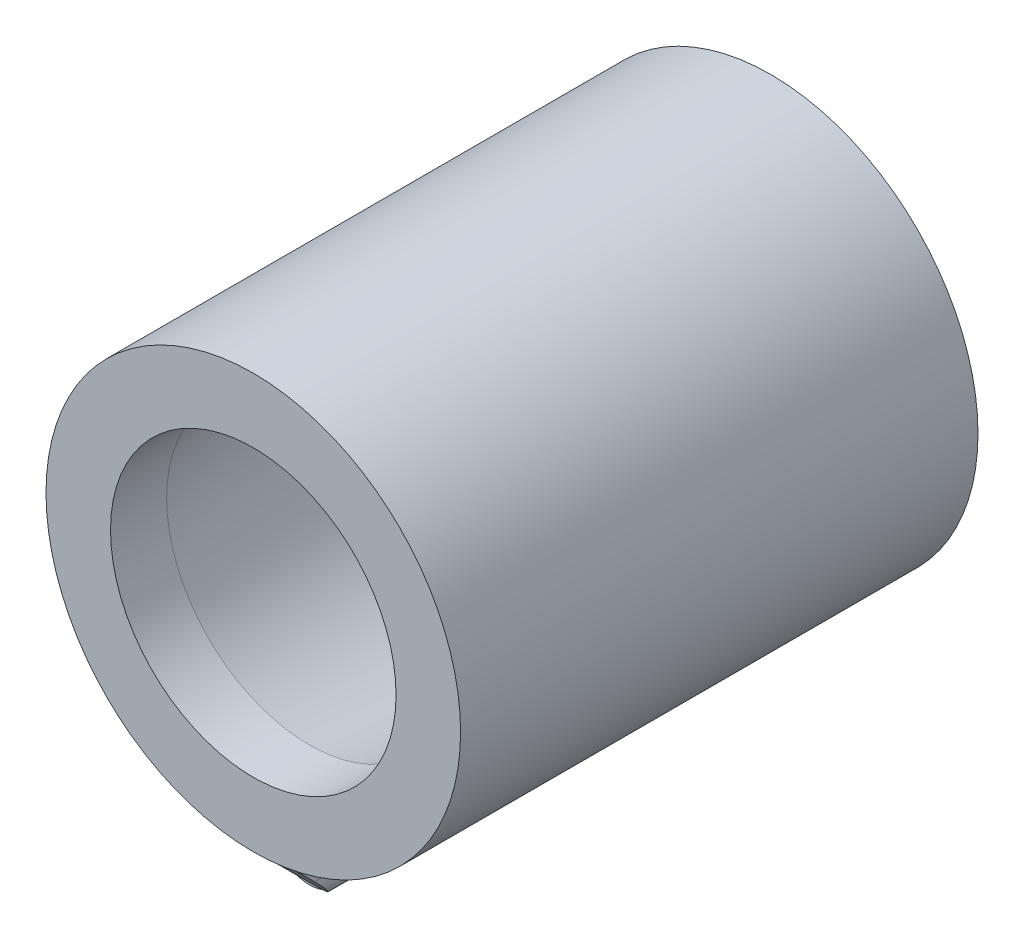
ISO-10303-21;
HEADER;
FILE_DESCRIPTION(('STEP AP214'),'2;1');
FILE_NAME('part.step','',(''),(''),'','','');
FILE_SCHEMA(('AUTOMOTIVE_DESIGN { 1 0 10303 214 1 1 1 1 }'));
ENDSEC;
DATA;
#1=APPLICATION_CONTEXT('core data for automotive mechanical design processes');
#2=APPLICATION_PROTOCOL_DEFINITION('international standard','automotive_design',2000,#1);
#3=PRODUCT_CONTEXT('',#1,'mechanical');
#4=PRODUCT('Part','Part','',(#3));
#5=PRODUCT_RELATED_PRODUCT_CATEGORY('part','',(#4));
#6=PRODUCT_DEFINITION_FORMATION('','',#4);
#7=PRODUCT_DEFINITION_CONTEXT('part definition',#1,'design');
#8=PRODUCT_DEFINITION('design','',#6,#7);
#9=PRODUCT_DEFINITION_SHAPE('','',#8);
#10=(LENGTH_UNIT() NAMED_UNIT(*) SI_UNIT(.MILLI.,.METRE.));
#11=(NAMED_UNIT(*) PLANE_ANGLE_UNIT() SI_UNIT($,.RADIAN.));
#12=(NAMED_UNIT(*) SI_UNIT($,.STERADIAN.) SOLID_ANGLE_UNIT());
#13=UNCERTAINTY_MEASURE_WITH_UNIT(LENGTH_MEASURE(1.E-05),#10,'distance_accuracy_value','');
#14=(GEOMETRIC_REPRESENTATION_CONTEXT(3) GLOBAL_UNCERTAINTY_ASSIGNED_CONTEXT((#13)) GLOBAL_UNIT_ASSIGNED_CONTEXT((#10,
#11,#12)) REPRESENTATION_CONTEXT('',''));
#15=CARTESIAN_POINT('',(0.,0.,0.));
#16=DIRECTION('',(0.,0.,1.));
#17=DIRECTION('',(1.,0.,0.));
#18=AXIS2_PLACEMENT_3D('',#15,#16,#17);
#19=CARTESIAN_POINT('',(0.,0.908019807691184,0.));
#20=DIRECTION('',(0.,0.,1.));
#21=DIRECTION('',(1.,0.,0.));
#22=AXIS2_PLACEMENT_3D('',#19,#20,#21);
#23=PLANE('',#22);
#24=CARTESIAN_POINT('',(0.,0.908019807691184,0.));
#25=DIRECTION('',(0.,0.,1.));
#26=DIRECTION('',(1.,0.,0.));
#27=AXIS2_PLACEMENT_3D('',#24,#25,#26);
#28=CIRCLE('',#27,6.25);
#29=CARTESIAN_POINT('',(6.25,0.908019807691184,0.));
#30=VERTEX_POINT('',#29);
#31=EDGE_CURVE('E153',#30,#30,#28,.T.);
#32=ORIENTED_EDGE('',*,*,#31,.T.);
#33=EDGE_LOOP('',(#32));
#34=FACE_BOUND('',#33,.T.);
#35=CARTESIAN_POINT('',(0.,-6.35801980769118,0.));
#36=DIRECTION('',(0.,0.,1.));
#37=DIRECTION('',(1.,0.,0.));
#38=AXIS2_PLACEMENT_3D('',#35,#36,#37);
#39=CIRCLE('',#38,1.2);
#40=CARTESIAN_POINT('',(1.2,-6.35801980769118,0.));
#41=VERTEX_POINT('',#40);
#42=CARTESIAN_POINT('',(0.,-7.55801980769118,0.));
#43=VERTEX_POINT('',#42);
#44=EDGE_CURVE('E174',#41,#43,#39,.F.);
#45=ORIENTED_EDGE('',*,*,#44,.T.);
#46=CARTESIAN_POINT('',(0.,-6.35801980769118,0.));
#47=DIRECTION('',(0.,0.,1.));
#48=DIRECTION('',(1.,0.,0.));
#49=AXIS2_PLACEMENT_3D('',#46,#47,#48);
#50=CIRCLE('',#49,1.2);
#51=CARTESIAN_POINT('',(-1.2,-6.35801980769118,0.));
#52=VERTEX_POINT('',#51);
#53=EDGE_CURVE('E177',#43,#52,#50,.F.);
#54=ORIENTED_EDGE('',*,*,#53,.T.);
#55=DIRECTION('',(0.,-1.,0.));
#56=VECTOR('',#55,1.);
#57=CARTESIAN_POINT('',(-1.2,-5.95801980769118,0.));
#58=LINE('',#57,#56);
#59=CARTESIAN_POINT('',(-1.2,-5.63281347255683,0.));
#60=VERTEX_POINT('',#59);
#61=EDGE_CURVE('E139',#60,#52,#58,.T.);
#62=ORIENTED_EDGE('',*,*,#61,.F.);
#63=CARTESIAN_POINT('',(0.,0.908019807691184,0.));
#64=DIRECTION('',(0.,0.,1.));
#65=DIRECTION('',(1.,0.,0.));
#66=AXIS2_PLACEMENT_3D('',#63,#64,#65);
#67=CIRCLE('',#66,6.65);
#68=CARTESIAN_POINT('',(1.2,-5.63281347255683,0.));
#69=VERTEX_POINT('',#68);
#70=EDGE_CURVE('E145',#69,#60,#67,.T.);
#71=ORIENTED_EDGE('',*,*,#70,.F.);
#72=DIRECTION('',(0.,1.,0.));
#73=VECTOR('',#72,1.);
#74=CARTESIAN_POINT('',(1.2,-7.95801980769118,0.));
#75=LINE('',#74,#73);
#76=EDGE_CURVE('E130',#41,#69,#75,.T.);
#77=ORIENTED_EDGE('',*,*,#76,.F.);
#78=EDGE_LOOP('',(#45,#54,#62,#71,#77));
#79=FACE_BOUND('',#78,.T.);
#80=ADVANCED_FACE('F69',(#34,#79),#23,.F.);
#81=CARTESIAN_POINT('',(0.,0.908019807691184,0.));
#82=DIRECTION('',(0.,0.,1.));
#83=DIRECTION('',(1.,0.,0.));
#84=AXIS2_PLACEMENT_3D('',#81,#82,#83);
#85=CYLINDRICAL_SURFACE('',#84,6.65);
#86=CARTESIAN_POINT('',(0.,0.908019807691184,16.55));
#87=DIRECTION('',(0.,0.,1.));
#88=DIRECTION('',(1.,0.,0.));
#89=AXIS2_PLACEMENT_3D('',#86,#87,#88);
#90=CIRCLE('',#89,6.65);
#91=CARTESIAN_POINT('',(-1.2,-5.63281347255683,16.55));
#92=VERTEX_POINT('',#91);
#93=CARTESIAN_POINT('',(1.2,-5.63281347255683,16.55));
#94=VERTEX_POINT('',#93);
#95=EDGE_CURVE('E148',#92,#94,#90,.T.);
#96=ORIENTED_EDGE('',*,*,#95,.T.);
#97=DIRECTION('',(0.,0.,1.));
#98=VECTOR('',#97,1.);
#99=CARTESIAN_POINT('',(1.2,-5.63281347255683,0.));
#100=LINE('',#99,#98);
#101=EDGE_CURVE('E133',#69,#94,#100,.T.);
#102=ORIENTED_EDGE('',*,*,#101,.F.);
#103=ORIENTED_EDGE('',*,*,#70,.T.);
#104=DIRECTION('',(0.,0.,1.));
#105=VECTOR('',#104,1.);
#106=CARTESIAN_POINT('',(-1.2,-5.63281347255683,0.));
#107=LINE('',#106,#105);
#108=EDGE_CURVE('E138',#60,#92,#107,.T.);
#109=ORIENTED_EDGE('',*,*,#108,.T.);
#110=EDGE_LOOP('',(#96,#102,#103,#109));
#111=FACE_BOUND('',#110,.T.);
#112=CARTESIAN_POINT('',(0.,0.908019807691184,16.6));
#113=DIRECTION('',(0.,0.,1.));
#114=DIRECTION('',(1.,0.,0.));
#115=AXIS2_PLACEMENT_3D('',#112,#113,#114);
#116=CIRCLE('',#115,6.65);
#117=CARTESIAN_POINT('',(6.65,0.908019807691184,16.6));
#118=VERTEX_POINT('',#117);
#119=EDGE_CURVE('E274',#118,#118,#116,.T.);
#120=ORIENTED_EDGE('',*,*,#119,.F.);
#121=EDGE_LOOP('',(#120));
#122=FACE_BOUND('',#121,.T.);
#123=ADVANCED_FACE('F143',(#111,#122),#85,.T.);
#124=CARTESIAN_POINT('',(1.2,-7.95801980769118,0.));
#125=DIRECTION('',(1.,0.,0.));
#126=DIRECTION('',(0.,1.,0.));
#127=AXIS2_PLACEMENT_3D('',#124,#125,#126);
#128=PLANE('',#127);
#129=ORIENTED_EDGE('',*,*,#101,.T.);
#130=CARTESIAN_POINT('',(1.2,-5.63281347255683,16.55));
#131=CARTESIAN_POINT('',(1.2,-5.7537731458832,16.4310159790793));
#132=CARTESIAN_POINT('',(1.2,-5.87468684426653,16.311985291966));
#133=CARTESIAN_POINT('',(1.2,-6.11642228930991,16.0738305871641));
#134=CARTESIAN_POINT('',(1.2,-6.23724403597137,15.9547065694769));
#135=CARTESIAN_POINT('',(1.2,-6.35801980769118,15.8355358855986));
#136=B_SPLINE_CURVE_WITH_KNOTS('',3,(#130,#131,#132,#133,#134,#135),.UNSPECIFIED.,.F.,.F.,(4,2,
4),(0.,0.509014579734837,1.0180291517328),.UNSPECIFIED.);
#137=CARTESIAN_POINT('',(1.2,-6.35801980769118,15.8355358855986));
#138=VERTEX_POINT('',#137);
#139=EDGE_CURVE('E191',#94,#138,#136,.T.);
#140=ORIENTED_EDGE('',*,*,#139,.T.);
#141=DIRECTION('',(0.,0.,1.));
#142=VECTOR('',#141,1.);
#143=CARTESIAN_POINT('',(1.2,-6.35801980769118,0.));
#144=LINE('',#143,#142);
#145=EDGE_CURVE('E99',#138,#41,#144,.F.);
#146=ORIENTED_EDGE('',*,*,#145,.T.);
#147=ORIENTED_EDGE('',*,*,#76,.T.);
#148=EDGE_LOOP('',(#129,#140,#146,#147));
#149=FACE_BOUND('',#148,.T.);
#150=ADVANCED_FACE('F132',(#149),#128,.T.);
#151=CARTESIAN_POINT('',(-1.2,-5.95801980769118,0.));
#152=DIRECTION('',(-1.,0.,0.));
#153=DIRECTION('',(0.,-1.,0.));
#154=AXIS2_PLACEMENT_3D('',#151,#152,#153);
#155=PLANE('',#154);
#156=ORIENTED_EDGE('',*,*,#61,.T.);
#157=DIRECTION('',(0.,0.,1.));
#158=VECTOR('',#157,1.);
#159=CARTESIAN_POINT('',(-1.2,-6.35801980769118,0.));
#160=LINE('',#159,#158);
#161=CARTESIAN_POINT('',(-1.2,-6.35801980769118,15.8355358855986));
#162=VERTEX_POINT('',#161);
#163=EDGE_CURVE('E91',#52,#162,#160,.T.);
#164=ORIENTED_EDGE('',*,*,#163,.T.);
#165=CARTESIAN_POINT('',(-1.2,-6.35801980769118,15.8355358855986));
#166=CARTESIAN_POINT('',(-1.2,-6.23724403597137,15.9547065694769));
#167=CARTESIAN_POINT('',(-1.2,-6.11642228930991,16.0738305871641));
#168=CARTESIAN_POINT('',(-1.2,-5.87468684426653,16.311985291966));
#169=CARTESIAN_POINT('',(-1.2,-5.75377314588321,16.4310159790793));
#170=CARTESIAN_POINT('',(-1.2,-5.63281347255683,16.55));
#171=B_SPLINE_CURVE_WITH_KNOTS('',3,(#165,#166,#167,#168,#169,#170),.UNSPECIFIED.,.F.,.F.,(4,2,
4),(0.,0.509014571997967,1.0180291517328),.UNSPECIFIED.);
#172=EDGE_CURVE('E12',#162,#92,#171,.T.);
#173=ORIENTED_EDGE('',*,*,#172,.T.);
#174=ORIENTED_EDGE('',*,*,#108,.F.);
#175=EDGE_LOOP('',(#156,#164,#173,#174));
#176=FACE_BOUND('',#175,.T.);
#177=ADVANCED_FACE('F207',(#176),#155,.T.);
#178=CARTESIAN_POINT('',(0.,0.908019807691184,0.));
#179=DIRECTION('',(0.,0.,1.));
#180=DIRECTION('',(1.,0.,0.));
#181=AXIS2_PLACEMENT_3D('',#178,#179,#180);
#182=CYLINDRICAL_SURFACE('',#181,6.25);
#183=ORIENTED_EDGE('',*,*,#31,.F.);
#184=EDGE_LOOP('',(#183));
#185=FACE_BOUND('',#184,.T.);
#186=CARTESIAN_POINT('',(0.,0.908019807691184,1.2));
#187=DIRECTION('',(0.,0.,-1.));
#188=DIRECTION('',(-1.,0.,0.));
#189=AXIS2_PLACEMENT_3D('',#186,#187,#188);
#190=CIRCLE('',#189,6.25);
#191=CARTESIAN_POINT('',(-6.25,0.908019807691184,1.2));
#192=VERTEX_POINT('',#191);
#193=EDGE_CURVE('E185',#192,#192,#190,.T.);
#194=ORIENTED_EDGE('',*,*,#193,.F.);
#195=EDGE_LOOP('',(#194));
#196=FACE_BOUND('',#195,.T.);
#197=ADVANCED_FACE('F208',(#185,#196),#182,.F.);
#198=CARTESIAN_POINT('',(0.,0.908019807691184,14.8));
#199=DIRECTION('',(0.,0.,1.));
#200=DIRECTION('',(1.,0.,0.));
#201=AXIS2_PLACEMENT_3D('',#198,#199,#200);
#202=PLANE('',#201);
#203=CARTESIAN_POINT('',(0.,-6.35801980769118,14.8));
#204=DIRECTION('',(0.,0.,1.));
#205=DIRECTION('',(1.,0.,0.));
#206=AXIS2_PLACEMENT_3D('',#203,#204,#205);
#207=CIRCLE('',#206,1.2);
#208=CARTESIAN_POINT('',(0.,-7.55801980769118,14.8));
#209=VERTEX_POINT('',#208);
#210=CARTESIAN_POINT('',(0.421990460882115,-7.48137373719181,14.8));
#211=VERTEX_POINT('',#210);
#212=EDGE_CURVE('E167',#209,#211,#207,.T.);
#213=ORIENTED_EDGE('',*,*,#212,.T.);
#214=CARTESIAN_POINT('',(0.,0.908019807691184,14.8));
#215=DIRECTION('',(0.,0.,1.));
#216=DIRECTION('',(1.,0.,0.));
#217=AXIS2_PLACEMENT_3D('',#214,#215,#216);
#218=CIRCLE('',#217,8.4);
#219=CARTESIAN_POINT('',(-0.421990460882117,-7.48137373719181,14.8));
#220=VERTEX_POINT('',#219);
#221=EDGE_CURVE('E188',#211,#220,#218,.F.);
#222=ORIENTED_EDGE('',*,*,#221,.T.);
#223=CARTESIAN_POINT('',(0.,-6.35801980769118,14.8));
#224=DIRECTION('',(0.,0.,1.));
#225=DIRECTION('',(1.,0.,0.));
#226=AXIS2_PLACEMENT_3D('',#223,#224,#225);
#227=CIRCLE('',#226,1.2);
#228=EDGE_CURVE('E171',#220,#209,#227,.T.);
#229=ORIENTED_EDGE('',*,*,#228,.T.);
#230=EDGE_LOOP('',(#213,#222,#229));
#231=FACE_BOUND('',#230,.T.);
#232=ADVANCED_FACE('F240',(#231),#202,.T.);
#233=CARTESIAN_POINT('',(0.,-6.35801980769118,0.));
#234=DIRECTION('',(0.,0.,1.));
#235=DIRECTION('',(1.,0.,0.));
#236=AXIS2_PLACEMENT_3D('',#233,#234,#235);
#237=CYLINDRICAL_SURFACE('',#236,1.2);
#238=DIRECTION('',(0.,0.,1.));
#239=VECTOR('',#238,1.);
#240=CARTESIAN_POINT('',(0.,-7.55801980769118,0.));
#241=LINE('',#240,#239);
#242=EDGE_CURVE('E159',#43,#209,#241,.T.);
#243=ORIENTED_EDGE('',*,*,#242,.F.);
#244=ORIENTED_EDGE('',*,*,#44,.F.);
#245=ORIENTED_EDGE('',*,*,#145,.F.);
#246=CARTESIAN_POINT('',(1.2,-6.35801980769118,15.8355358855986));
#247=CARTESIAN_POINT('',(1.19999418190122,-6.39390520938087,15.8001295106087));
#248=CARTESIAN_POINT('',(1.19838989133415,-6.42990885621507,15.7648632436293));
#249=CARTESIAN_POINT('',(1.19187918033322,-6.50203298440905,15.6947102813898));
#250=CARTESIAN_POINT('',(1.18697053619795,-6.53815352813475,15.6598238578258));
#251=CARTESIAN_POINT('',(1.16704292442703,-6.64693073870465,15.5554822138805));
#252=CARTESIAN_POINT('',(1.14681919111417,-6.71950865779057,15.4868318767082));
#253=CARTESIAN_POINT('',(1.09387919314243,-6.85636388045929,15.3590150512431));
#254=CARTESIAN_POINT('',(1.0623768199223,-6.9208208537706,15.2995392547474));
#255=CARTESIAN_POINT('',(0.986009826446264,-7.04586348424103,15.1853652934202));
#256=CARTESIAN_POINT('',(0.941175833689546,-7.10645763234883,15.130656545497));
#257=CARTESIAN_POINT('',(0.849460267767726,-7.20768849702905,15.0400771700176));
#258=CARTESIAN_POINT('',(0.805487015406882,-7.24968669422344,15.0027865439766));
#259=CARTESIAN_POINT('',(0.709158679398586,-7.32803187937692,14.9336336812599));
#260=CARTESIAN_POINT('',(0.656829763617109,-7.36439583393496,14.901755118149));
#261=CARTESIAN_POINT('',(0.572681201480812,-7.41304419808079,14.859302768563));
#262=CARTESIAN_POINT('',(0.543824759353765,-7.42822474791737,14.8460915578018));
#263=CARTESIAN_POINT('',(0.48425757957659,-7.45646576386683,14.8215643128733));
#264=CARTESIAN_POINT('',(0.453543681774039,-7.46952246899425,14.8102516396089));
#265=CARTESIAN_POINT('',(0.421990460882115,-7.48137373719181,14.8));
#266=B_SPLINE_CURVE_WITH_KNOTS('',3,(#246,#247,#248,#249,#250,#251,#252,#253,#254,#255,#256,
#257,#258,#259,#260,#261,#262,#263,#264,#265),.UNSPECIFIED.,.F.,.F.,(4,2,2,2,2,2,2,2,2,4),(0.,
0.151178248106144,0.302458335132545,0.60708440724797,0.885704308522836,1.16368900151872,
1.37693669052913,1.58952918659909,1.69492566378336,1.80050679569367),.UNSPECIFIED.);
#267=EDGE_CURVE('E199',#138,#211,#266,.T.);
#268=ORIENTED_EDGE('',*,*,#267,.T.);
#269=ORIENTED_EDGE('',*,*,#212,.F.);
#270=EDGE_LOOP('',(#243,#244,#245,#268,#269));
#271=FACE_BOUND('',#270,.T.);
#272=ADVANCED_FACE('F222',(#271),#237,.T.);
#273=CARTESIAN_POINT('',(0.,-6.35801980769118,0.));
#274=DIRECTION('',(0.,0.,1.));
#275=DIRECTION('',(1.,0.,0.));
#276=AXIS2_PLACEMENT_3D('',#273,#274,#275);
#277=CYLINDRICAL_SURFACE('',#276,1.2);
#278=ORIENTED_EDGE('',*,*,#53,.F.);
#279=ORIENTED_EDGE('',*,*,#242,.T.);
#280=ORIENTED_EDGE('',*,*,#228,.F.);
#281=CARTESIAN_POINT('',(-0.421990460882118,-7.48137373719181,14.8));
#282=CARTESIAN_POINT('',(-0.484498144851121,-7.45792084505365,14.8202846087777));
#283=CARTESIAN_POINT('',(-0.543524743503314,-7.42978042810623,14.8447006021819));
#284=CARTESIAN_POINT('',(-0.653510007973081,-7.3664295211895,14.8999781065066));
#285=CARTESIAN_POINT('',(-0.70453883657356,-7.33128747421718,14.9307773284471));
#286=CARTESIAN_POINT('',(-0.798346523241916,-7.25593773940295,14.9972537084798));
#287=CARTESIAN_POINT('',(-0.841170139734047,-7.21575963417682,15.0329024761857));
#288=CARTESIAN_POINT('',(-0.919175706578481,-7.13159310781122,15.1081286139944));
#289=CARTESIAN_POINT('',(-0.954334576115915,-7.08759372112788,15.1477173410394));
#290=CARTESIAN_POINT('',(-1.03426350370698,-6.97246182741976,15.2521419487199));
#291=CARTESIAN_POINT('',(-1.07387404920628,-6.89957776492882,15.3190069860518));
#292=CARTESIAN_POINT('',(-1.13668855635416,-6.75102751890168,15.457174931166));
#293=CARTESIAN_POINT('',(-1.15987174518935,-6.67535793968005,15.5284833342433));
#294=CARTESIAN_POINT('',(-1.18374825209065,-6.5591065157232,15.6396405138596));
#295=CARTESIAN_POINT('',(-1.18988937950581,-6.51868731208086,15.6785840274641));
#296=CARTESIAN_POINT('',(-1.19800173538068,-6.43813457982848,15.756809028324));
#297=CARTESIAN_POINT('',(-1.19999292038489,-6.3980006133076,15.7960879817422));
#298=CARTESIAN_POINT('',(-1.2,-6.35801980769118,15.8355358855986));
#299=B_SPLINE_CURVE_WITH_KNOTS('',3,(#281,#282,#283,#284,#285,#286,#287,#288,#289,#290,#291,
#292,#293,#294,#295,#296,#297,#298),.UNSPECIFIED.,.F.,.F.,(4,2,2,2,2,2,2,2,4),(0.,
0.20847792473999,0.415009937330288,0.620381097284845,0.826362400065756,1.14427679649769,
1.46259248986075,1.63184522811036,1.80028215561754),.UNSPECIFIED.);
#300=EDGE_CURVE('E85',#220,#162,#299,.T.);
#301=ORIENTED_EDGE('',*,*,#300,.T.);
#302=ORIENTED_EDGE('',*,*,#163,.F.);
#303=EDGE_LOOP('',(#278,#279,#280,#301,#302));
#304=FACE_BOUND('',#303,.T.);
#305=ADVANCED_FACE('F218',(#304),#277,.T.);
#306=CARTESIAN_POINT('',(0.,0.908019807691184,1.2));
#307=DIRECTION('',(0.,0.,-1.));
#308=DIRECTION('',(-1.,0.,0.));
#309=AXIS2_PLACEMENT_3D('',#306,#307,#308);
#310=CONICAL_SURFACE('',#309,6.25,0.122173047639603);
#311=CARTESIAN_POINT('',(0.,0.908019807691184,14.8));
#312=DIRECTION('',(0.,0.,1.));
#313=DIRECTION('',(1.,0.,0.));
#314=AXIS2_PLACEMENT_3D('',#311,#312,#313);
#315=CIRCLE('',#314,4.58012997172049);
#316=CARTESIAN_POINT('',(4.58012997172049,0.908019807691184,14.8));
#317=VERTEX_POINT('',#316);
#318=EDGE_CURVE('E280',#317,#317,#315,.T.);
#319=ORIENTED_EDGE('',*,*,#318,.T.);
#320=EDGE_LOOP('',(#319));
#321=FACE_BOUND('',#320,.T.);
#322=ORIENTED_EDGE('',*,*,#193,.T.);
#323=EDGE_LOOP('',(#322));
#324=FACE_BOUND('',#323,.T.);
#325=ADVANCED_FACE('F221',(#321,#324),#310,.F.);
#326=CARTESIAN_POINT('',(0.,0.908019807691184,16.6));
#327=DIRECTION('',(0.,0.,1.));
#328=DIRECTION('',(1.,0.,0.));
#329=AXIS2_PLACEMENT_3D('',#326,#327,#328);
#330=PLANE('',#329);
#331=ORIENTED_EDGE('',*,*,#119,.T.);
#332=EDGE_LOOP('',(#331));
#333=FACE_BOUND('',#332,.T.);
#334=CARTESIAN_POINT('',(0.,0.908019807691184,16.6));
#335=DIRECTION('',(0.,0.,1.));
#336=DIRECTION('',(1.,0.,0.));
#337=AXIS2_PLACEMENT_3D('',#334,#335,#336);
#338=CIRCLE('',#337,4.58012997172049);
#339=CARTESIAN_POINT('',(4.58012997172049,0.908019807691184,16.6));
#340=VERTEX_POINT('',#339);
#341=EDGE_CURVE('E277',#340,#340,#338,.T.);
#342=ORIENTED_EDGE('',*,*,#341,.F.);
#343=EDGE_LOOP('',(#342));
#344=FACE_BOUND('',#343,.T.);
#345=ADVANCED_FACE('F247',(#333,#344),#330,.T.);
#346=CARTESIAN_POINT('',(0.,0.908019807691184,16.6));
#347=DIRECTION('',(0.,0.,-1.));
#348=DIRECTION('',(-1.,0.,0.));
#349=AXIS2_PLACEMENT_3D('',#346,#347,#348);
#350=CYLINDRICAL_SURFACE('',#349,4.58012997172049);
#351=ORIENTED_EDGE('',*,*,#341,.T.);
#352=EDGE_LOOP('',(#351));
#353=FACE_BOUND('',#352,.T.);
#354=ORIENTED_EDGE('',*,*,#318,.F.);
#355=EDGE_LOOP('',(#354));
#356=FACE_BOUND('',#355,.T.);
#357=ADVANCED_FACE('F243',(#353,#356),#350,.F.);
#358=CARTESIAN_POINT('',(0.,0.908019807691184,16.55));
#359=DIRECTION('',(0.,0.,-1.));
#360=DIRECTION('',(-1.,0.,0.));
#361=AXIS2_PLACEMENT_3D('',#358,#359,#360);
#362=CONICAL_SURFACE('',#361,6.65,0.785398163397442);
#363=ORIENTED_EDGE('',*,*,#300,.F.);
#364=ORIENTED_EDGE('',*,*,#221,.F.);
#365=ORIENTED_EDGE('',*,*,#267,.F.);
#366=ORIENTED_EDGE('',*,*,#139,.F.);
#367=ORIENTED_EDGE('',*,*,#95,.F.);
#368=ORIENTED_EDGE('',*,*,#172,.F.);
#369=EDGE_LOOP('',(#363,#364,#365,#366,#367,#368));
#370=FACE_BOUND('',#369,.T.);
#371=ADVANCED_FACE('F72',(#370),#362,.T.);
#372=CLOSED_SHELL('',(#80,#123,#150,#177,#197,#232,#272,#305,#325,#345,#357,#371));
#373=MANIFOLD_SOLID_BREP('B2',#372);
#374=ADVANCED_BREP_SHAPE_REPRESENTATION('',(#18,#373),#14);
#375=SHAPE_DEFINITION_REPRESENTATION(#9,#374);
ENDSEC;
END-ISO-10303-21;
